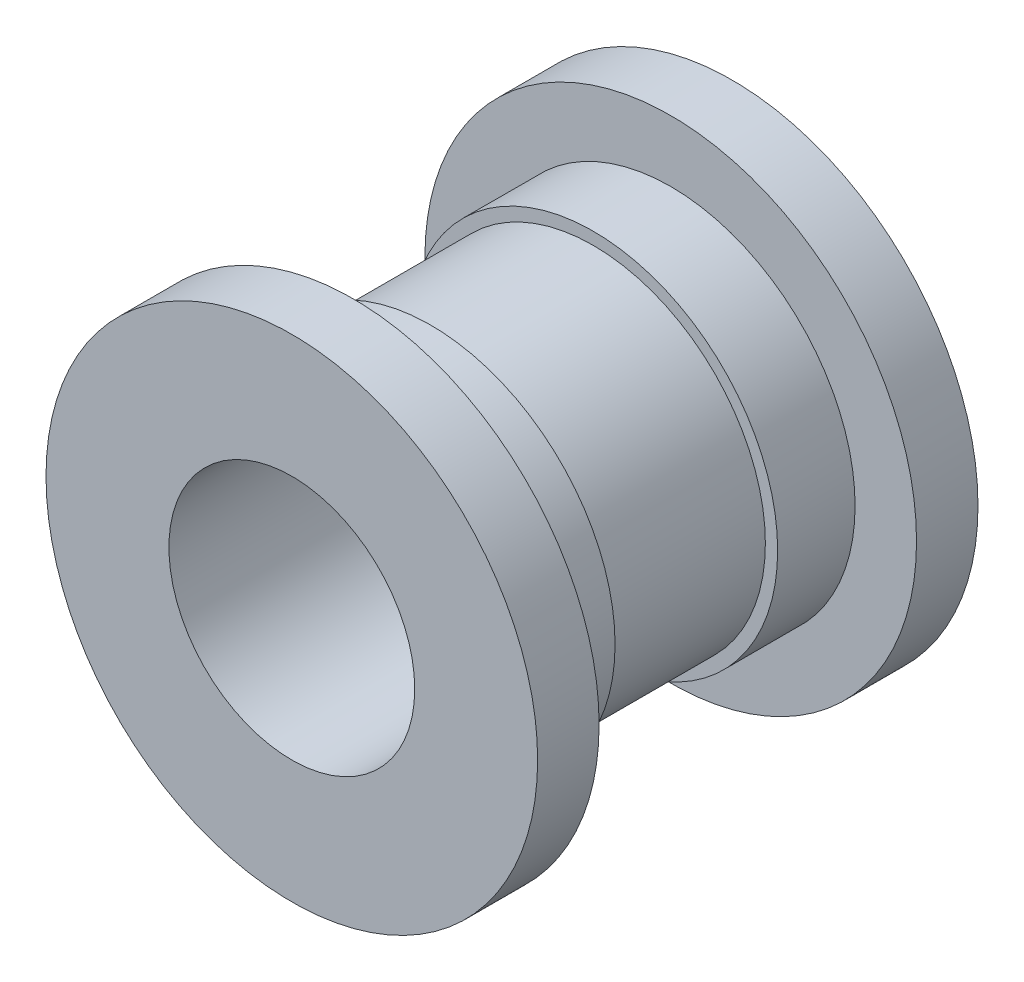
ISO-10303-21;
HEADER;
FILE_DESCRIPTION(('STEP AP214'),'2;1');
FILE_NAME('part.step','',(''),(''),'','','');
FILE_SCHEMA(('AUTOMOTIVE_DESIGN { 1 0 10303 214 1 1 1 1 }'));
ENDSEC;
DATA;
#1=APPLICATION_CONTEXT('core data for automotive mechanical design processes');
#2=APPLICATION_PROTOCOL_DEFINITION('international standard','automotive_design',2000,#1);
#3=PRODUCT_CONTEXT('',#1,'mechanical');
#4=PRODUCT('Part','Part','',(#3));
#5=PRODUCT_RELATED_PRODUCT_CATEGORY('part','',(#4));
#6=PRODUCT_DEFINITION_FORMATION('','',#4);
#7=PRODUCT_DEFINITION_CONTEXT('part definition',#1,'design');
#8=PRODUCT_DEFINITION('design','',#6,#7);
#9=PRODUCT_DEFINITION_SHAPE('','',#8);
#10=(LENGTH_UNIT() NAMED_UNIT(*) SI_UNIT(.MILLI.,.METRE.));
#11=(NAMED_UNIT(*) PLANE_ANGLE_UNIT() SI_UNIT($,.RADIAN.));
#12=(NAMED_UNIT(*) SI_UNIT($,.STERADIAN.) SOLID_ANGLE_UNIT());
#13=UNCERTAINTY_MEASURE_WITH_UNIT(LENGTH_MEASURE(1.E-05),#10,'distance_accuracy_value','');
#14=(GEOMETRIC_REPRESENTATION_CONTEXT(3) GLOBAL_UNCERTAINTY_ASSIGNED_CONTEXT((#13)) GLOBAL_UNIT_ASSIGNED_CONTEXT((#10,
#11,#12)) REPRESENTATION_CONTEXT('',''));
#15=CARTESIAN_POINT('',(0.,0.,0.));
#16=DIRECTION('',(0.,0.,1.));
#17=DIRECTION('',(1.,0.,0.));
#18=AXIS2_PLACEMENT_3D('',#15,#16,#17);
#19=CARTESIAN_POINT('',(0.,0.,2.1));
#20=DIRECTION('',(0.,0.,-1.));
#21=DIRECTION('',(-1.,0.,0.));
#22=AXIS2_PLACEMENT_3D('',#19,#20,#21);
#23=CYLINDRICAL_SURFACE('',#22,4.445);
#24=CARTESIAN_POINT('',(0.,0.,2.1));
#25=DIRECTION('',(0.,0.,1.));
#26=DIRECTION('',(1.,0.,0.));
#27=AXIS2_PLACEMENT_3D('',#24,#25,#26);
#28=CIRCLE('',#27,4.445);
#29=CARTESIAN_POINT('',(4.445,0.,2.1));
#30=VERTEX_POINT('',#29);
#31=EDGE_CURVE('E10',#30,#30,#28,.T.);
#32=ORIENTED_EDGE('',*,*,#31,.F.);
#33=EDGE_LOOP('',(#32));
#34=FACE_BOUND('',#33,.T.);
#35=CARTESIAN_POINT('',(0.,0.,-2.1));
#36=DIRECTION('',(0.,0.,-1.));
#37=DIRECTION('',(-1.,0.,0.));
#38=AXIS2_PLACEMENT_3D('',#35,#36,#37);
#39=CIRCLE('',#38,4.445);
#40=CARTESIAN_POINT('',(-4.445,0.,-2.1));
#41=VERTEX_POINT('',#40);
#42=EDGE_CURVE('E66',#41,#41,#39,.T.);
#43=ORIENTED_EDGE('',*,*,#42,.F.);
#44=EDGE_LOOP('',(#43));
#45=FACE_BOUND('',#44,.T.);
#46=ADVANCED_FACE('F40',(#34,#45),#23,.T.);
#47=CARTESIAN_POINT('',(0.,0.,2.1));
#48=DIRECTION('',(0.,0.,1.));
#49=DIRECTION('',(1.,0.,0.));
#50=AXIS2_PLACEMENT_3D('',#47,#48,#49);
#51=PLANE('',#50);
#52=CARTESIAN_POINT('',(0.,0.,2.1));
#53=DIRECTION('',(0.,0.,1.));
#54=DIRECTION('',(1.,0.,0.));
#55=AXIS2_PLACEMENT_3D('',#52,#53,#54);
#56=CIRCLE('',#55,4.7625);
#57=CARTESIAN_POINT('',(4.7625,0.,2.1));
#58=VERTEX_POINT('',#57);
#59=EDGE_CURVE('E54',#58,#58,#56,.T.);
#60=ORIENTED_EDGE('',*,*,#59,.F.);
#61=EDGE_LOOP('',(#60));
#62=FACE_BOUND('',#61,.T.);
#63=ORIENTED_EDGE('',*,*,#31,.T.);
#64=EDGE_LOOP('',(#63));
#65=FACE_BOUND('',#64,.T.);
#66=ADVANCED_FACE('F129',(#62,#65),#51,.F.);
#67=CARTESIAN_POINT('',(0.,0.,4.1));
#68=DIRECTION('',(0.,0.,-1.));
#69=DIRECTION('',(-1.,0.,0.));
#70=AXIS2_PLACEMENT_3D('',#67,#68,#69);
#71=CYLINDRICAL_SURFACE('',#70,4.7625);
#72=CARTESIAN_POINT('',(0.,0.,4.1));
#73=DIRECTION('',(0.,0.,1.));
#74=DIRECTION('',(1.,0.,0.));
#75=AXIS2_PLACEMENT_3D('',#72,#73,#74);
#76=CIRCLE('',#75,4.7625);
#77=CARTESIAN_POINT('',(4.7625,0.,4.1));
#78=VERTEX_POINT('',#77);
#79=EDGE_CURVE('E47',#78,#78,#76,.T.);
#80=ORIENTED_EDGE('',*,*,#79,.F.);
#81=EDGE_LOOP('',(#80));
#82=FACE_BOUND('',#81,.T.);
#83=ORIENTED_EDGE('',*,*,#59,.T.);
#84=EDGE_LOOP('',(#83));
#85=FACE_BOUND('',#84,.T.);
#86=ADVANCED_FACE('F124',(#82,#85),#71,.T.);
#87=CARTESIAN_POINT('',(0.,0.,4.1));
#88=DIRECTION('',(0.,0.,1.));
#89=DIRECTION('',(1.,0.,0.));
#90=AXIS2_PLACEMENT_3D('',#87,#88,#89);
#91=PLANE('',#90);
#92=CARTESIAN_POINT('',(0.,0.,4.1));
#93=DIRECTION('',(0.,0.,1.));
#94=DIRECTION('',(1.,0.,0.));
#95=AXIS2_PLACEMENT_3D('',#92,#93,#94);
#96=CIRCLE('',#95,6.35);
#97=CARTESIAN_POINT('',(6.35,0.,4.1));
#98=VERTEX_POINT('',#97);
#99=EDGE_CURVE('E63',#98,#98,#96,.T.);
#100=ORIENTED_EDGE('',*,*,#99,.F.);
#101=EDGE_LOOP('',(#100));
#102=FACE_BOUND('',#101,.T.);
#103=ORIENTED_EDGE('',*,*,#79,.T.);
#104=EDGE_LOOP('',(#103));
#105=FACE_BOUND('',#104,.T.);
#106=ADVANCED_FACE('F119',(#102,#105),#91,.F.);
#107=CARTESIAN_POINT('',(0.,0.,5.6875));
#108=DIRECTION('',(0.,0.,-1.));
#109=DIRECTION('',(-1.,0.,0.));
#110=AXIS2_PLACEMENT_3D('',#107,#108,#109);
#111=CYLINDRICAL_SURFACE('',#110,6.35);
#112=CARTESIAN_POINT('',(0.,0.,5.6875));
#113=DIRECTION('',(0.,0.,1.));
#114=DIRECTION('',(1.,0.,0.));
#115=AXIS2_PLACEMENT_3D('',#112,#113,#114);
#116=CIRCLE('',#115,6.35);
#117=CARTESIAN_POINT('',(6.35,0.,5.6875));
#118=VERTEX_POINT('',#117);
#119=EDGE_CURVE('E61',#118,#118,#116,.T.);
#120=ORIENTED_EDGE('',*,*,#119,.F.);
#121=EDGE_LOOP('',(#120));
#122=FACE_BOUND('',#121,.T.);
#123=ORIENTED_EDGE('',*,*,#99,.T.);
#124=EDGE_LOOP('',(#123));
#125=FACE_BOUND('',#124,.T.);
#126=ADVANCED_FACE('F113',(#122,#125),#111,.T.);
#127=CARTESIAN_POINT('',(0.,0.,5.6875));
#128=DIRECTION('',(0.,0.,1.));
#129=DIRECTION('',(1.,0.,0.));
#130=AXIS2_PLACEMENT_3D('',#127,#128,#129);
#131=PLANE('',#130);
#132=CARTESIAN_POINT('',(0.,0.,5.6875));
#133=DIRECTION('',(0.,0.,1.));
#134=DIRECTION('',(1.,0.,0.));
#135=AXIS2_PLACEMENT_3D('',#132,#133,#134);
#136=CIRCLE('',#135,3.175);
#137=CARTESIAN_POINT('',(3.175,0.,5.6875));
#138=VERTEX_POINT('',#137);
#139=EDGE_CURVE('E90',#138,#138,#136,.T.);
#140=ORIENTED_EDGE('',*,*,#139,.F.);
#141=EDGE_LOOP('',(#140));
#142=FACE_BOUND('',#141,.T.);
#143=ORIENTED_EDGE('',*,*,#119,.T.);
#144=EDGE_LOOP('',(#143));
#145=FACE_BOUND('',#144,.T.);
#146=ADVANCED_FACE('F109',(#142,#145),#131,.T.);
#147=CARTESIAN_POINT('',(0.,0.,-2.1));
#148=DIRECTION('',(0.,0.,-1.));
#149=DIRECTION('',(1.,0.,0.));
#150=AXIS2_PLACEMENT_3D('',#147,#148,#149);
#151=PLANE('',#150);
#152=CARTESIAN_POINT('',(0.,0.,-2.1));
#153=DIRECTION('',(0.,0.,1.));
#154=DIRECTION('',(1.,0.,0.));
#155=AXIS2_PLACEMENT_3D('',#152,#153,#154);
#156=CIRCLE('',#155,4.7625);
#157=CARTESIAN_POINT('',(4.7625,0.,-2.1));
#158=VERTEX_POINT('',#157);
#159=EDGE_CURVE('E73',#158,#158,#156,.T.);
#160=ORIENTED_EDGE('',*,*,#159,.T.);
#161=EDGE_LOOP('',(#160));
#162=FACE_BOUND('',#161,.T.);
#163=ORIENTED_EDGE('',*,*,#42,.T.);
#164=EDGE_LOOP('',(#163));
#165=FACE_BOUND('',#164,.T.);
#166=ADVANCED_FACE('F112',(#162,#165),#151,.F.);
#167=CARTESIAN_POINT('',(0.,0.,-4.1));
#168=DIRECTION('',(0.,0.,1.));
#169=DIRECTION('',(1.,0.,0.));
#170=AXIS2_PLACEMENT_3D('',#167,#168,#169);
#171=CYLINDRICAL_SURFACE('',#170,4.7625);
#172=CARTESIAN_POINT('',(0.,0.,-4.1));
#173=DIRECTION('',(0.,0.,-1.));
#174=DIRECTION('',(-1.,0.,0.));
#175=AXIS2_PLACEMENT_3D('',#172,#173,#174);
#176=CIRCLE('',#175,4.7625);
#177=CARTESIAN_POINT('',(-4.7625,0.,-4.1));
#178=VERTEX_POINT('',#177);
#179=EDGE_CURVE('E77',#178,#178,#176,.F.);
#180=ORIENTED_EDGE('',*,*,#179,.T.);
#181=EDGE_LOOP('',(#180));
#182=FACE_BOUND('',#181,.T.);
#183=ORIENTED_EDGE('',*,*,#159,.F.);
#184=EDGE_LOOP('',(#183));
#185=FACE_BOUND('',#184,.T.);
#186=ADVANCED_FACE('F142',(#182,#185),#171,.T.);
#187=CARTESIAN_POINT('',(0.,0.,-5.6875));
#188=DIRECTION('',(0.,0.,1.));
#189=DIRECTION('',(1.,0.,0.));
#190=AXIS2_PLACEMENT_3D('',#187,#188,#189);
#191=CYLINDRICAL_SURFACE('',#190,6.35);
#192=CARTESIAN_POINT('',(0.,0.,-5.6875));
#193=DIRECTION('',(0.,0.,1.));
#194=DIRECTION('',(1.,0.,0.));
#195=AXIS2_PLACEMENT_3D('',#192,#193,#194);
#196=CIRCLE('',#195,6.35);
#197=CARTESIAN_POINT('',(6.35,0.,-5.6875));
#198=VERTEX_POINT('',#197);
#199=EDGE_CURVE('E81',#198,#198,#196,.T.);
#200=ORIENTED_EDGE('',*,*,#199,.T.);
#201=EDGE_LOOP('',(#200));
#202=FACE_BOUND('',#201,.T.);
#203=CARTESIAN_POINT('',(0.,0.,-4.1));
#204=DIRECTION('',(0.,0.,1.));
#205=DIRECTION('',(1.,0.,0.));
#206=AXIS2_PLACEMENT_3D('',#203,#204,#205);
#207=CIRCLE('',#206,6.35);
#208=CARTESIAN_POINT('',(6.35,0.,-4.1));
#209=VERTEX_POINT('',#208);
#210=EDGE_CURVE('E82',#209,#209,#207,.T.);
#211=ORIENTED_EDGE('',*,*,#210,.F.);
#212=EDGE_LOOP('',(#211));
#213=FACE_BOUND('',#212,.T.);
#214=ADVANCED_FACE('F148',(#202,#213),#191,.T.);
#215=CARTESIAN_POINT('',(0.,0.,-5.6875));
#216=DIRECTION('',(0.,0.,-1.));
#217=DIRECTION('',(1.,0.,0.));
#218=AXIS2_PLACEMENT_3D('',#215,#216,#217);
#219=PLANE('',#218);
#220=CARTESIAN_POINT('',(0.,0.,-5.6875));
#221=DIRECTION('',(0.,0.,1.));
#222=DIRECTION('',(1.,0.,0.));
#223=AXIS2_PLACEMENT_3D('',#220,#221,#222);
#224=CIRCLE('',#223,3.175);
#225=CARTESIAN_POINT('',(3.175,0.,-5.6875));
#226=VERTEX_POINT('',#225);
#227=EDGE_CURVE('E86',#226,#226,#224,.T.);
#228=ORIENTED_EDGE('',*,*,#227,.T.);
#229=EDGE_LOOP('',(#228));
#230=FACE_BOUND('',#229,.T.);
#231=ORIENTED_EDGE('',*,*,#199,.F.);
#232=EDGE_LOOP('',(#231));
#233=FACE_BOUND('',#232,.T.);
#234=ADVANCED_FACE('F99',(#230,#233),#219,.T.);
#235=CARTESIAN_POINT('',(0.,0.,-4.1));
#236=DIRECTION('',(0.,0.,-1.));
#237=DIRECTION('',(1.,0.,0.));
#238=AXIS2_PLACEMENT_3D('',#235,#236,#237);
#239=PLANE('',#238);
#240=ORIENTED_EDGE('',*,*,#179,.F.);
#241=EDGE_LOOP('',(#240));
#242=FACE_BOUND('',#241,.T.);
#243=ORIENTED_EDGE('',*,*,#210,.T.);
#244=EDGE_LOOP('',(#243));
#245=FACE_BOUND('',#244,.T.);
#246=ADVANCED_FACE('F105',(#242,#245),#239,.F.);
#247=CARTESIAN_POINT('',(0.,0.,-5.6875));
#248=DIRECTION('',(0.,0.,1.));
#249=DIRECTION('',(1.,0.,0.));
#250=AXIS2_PLACEMENT_3D('',#247,#248,#249);
#251=CYLINDRICAL_SURFACE('',#250,3.175);
#252=ORIENTED_EDGE('',*,*,#227,.F.);
#253=EDGE_LOOP('',(#252));
#254=FACE_BOUND('',#253,.T.);
#255=ORIENTED_EDGE('',*,*,#139,.T.);
#256=EDGE_LOOP('',(#255));
#257=FACE_BOUND('',#256,.T.);
#258=ADVANCED_FACE('F102',(#254,#257),#251,.F.);
#259=CLOSED_SHELL('',(#46,#66,#86,#106,#126,#146,#166,#186,#214,#234,#246,#258));
#260=MANIFOLD_SOLID_BREP('B2',#259);
#261=ADVANCED_BREP_SHAPE_REPRESENTATION('',(#18,#260),#14);
#262=SHAPE_DEFINITION_REPRESENTATION(#9,#261);
ENDSEC;
END-ISO-10303-21;
